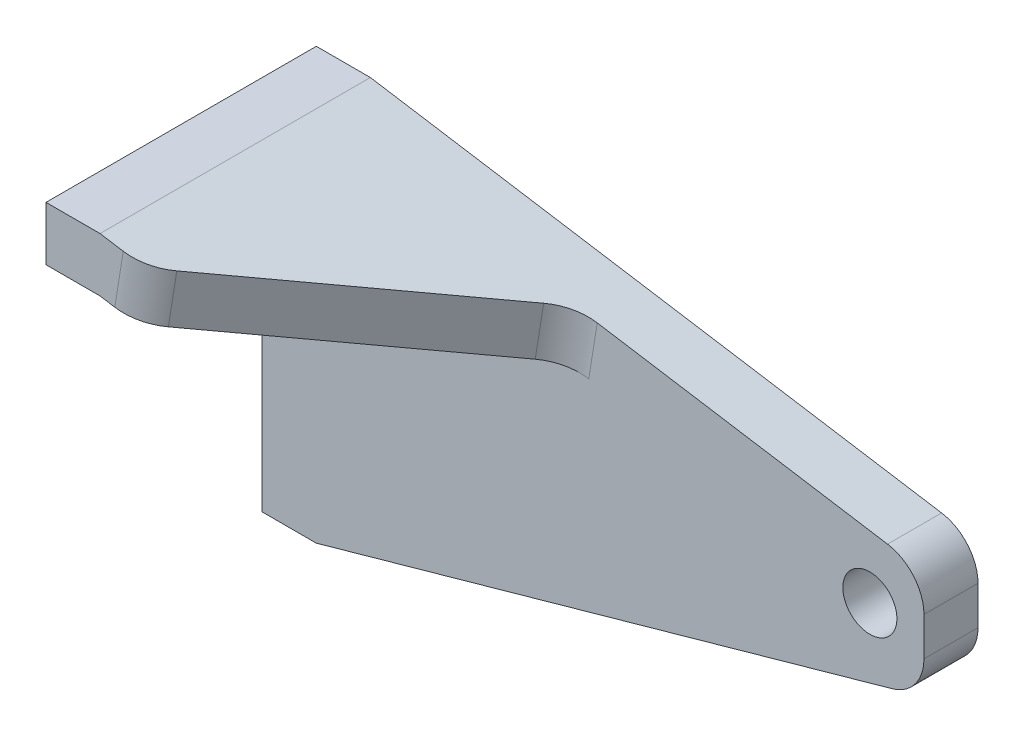
ISO-10303-21;
HEADER;
FILE_DESCRIPTION(('STEP AP214'),'2;1');
FILE_NAME('part.step','',(''),(''),'','','');
FILE_SCHEMA(('AUTOMOTIVE_DESIGN { 1 0 10303 214 1 1 1 1 }'));
ENDSEC;
DATA;
#1=APPLICATION_CONTEXT('core data for automotive mechanical design processes');
#2=APPLICATION_PROTOCOL_DEFINITION('international standard','automotive_design',2000,#1);
#3=PRODUCT_CONTEXT('',#1,'mechanical');
#4=PRODUCT('Part','Part','',(#3));
#5=PRODUCT_RELATED_PRODUCT_CATEGORY('part','',(#4));
#6=PRODUCT_DEFINITION_FORMATION('','',#4);
#7=PRODUCT_DEFINITION_CONTEXT('part definition',#1,'design');
#8=PRODUCT_DEFINITION('design','',#6,#7);
#9=PRODUCT_DEFINITION_SHAPE('','',#8);
#10=(LENGTH_UNIT() NAMED_UNIT(*) SI_UNIT(.MILLI.,.METRE.));
#11=(NAMED_UNIT(*) PLANE_ANGLE_UNIT() SI_UNIT($,.RADIAN.));
#12=(NAMED_UNIT(*) SI_UNIT($,.STERADIAN.) SOLID_ANGLE_UNIT());
#13=UNCERTAINTY_MEASURE_WITH_UNIT(LENGTH_MEASURE(1.E-05),#10,'distance_accuracy_value','');
#14=(GEOMETRIC_REPRESENTATION_CONTEXT(3) GLOBAL_UNCERTAINTY_ASSIGNED_CONTEXT((#13)) GLOBAL_UNIT_ASSIGNED_CONTEXT((#10,
#11,#12)) REPRESENTATION_CONTEXT('',''));
#15=CARTESIAN_POINT('',(0.,0.,0.));
#16=DIRECTION('',(0.,0.,1.));
#17=DIRECTION('',(1.,0.,0.));
#18=AXIS2_PLACEMENT_3D('',#15,#16,#17);
#19=CARTESIAN_POINT('',(0.,0.,-66.0761656667991));
#20=DIRECTION('',(0.,0.,1.));
#21=DIRECTION('',(1.,0.,0.));
#22=AXIS2_PLACEMENT_3D('',#19,#20,#21);
#23=PLANE('',#22);
#24=CARTESIAN_POINT('',(-87.0098258593013,74.4434540181082,-66.0761656667991));
#25=DIRECTION('',(0.,0.,1.));
#26=DIRECTION('',(1.,0.,0.));
#27=AXIS2_PLACEMENT_3D('',#24,#25,#26);
#28=CIRCLE('',#27,1.5875);
#29=CARTESIAN_POINT('',(-85.4223258593013,74.4434540181082,-66.0761656667991));
#30=VERTEX_POINT('',#29);
#31=EDGE_CURVE('E232',#30,#30,#28,.T.);
#32=ORIENTED_EDGE('',*,*,#31,.F.);
#33=EDGE_LOOP('',(#32));
#34=FACE_BOUND('',#33,.T.);
#35=DIRECTION('',(-0.987418694508758,0.158127548942683,0.));
#36=VECTOR('',#35,1.);
#37=CARTESIAN_POINT('',(10.0229648173004,62.5878469702539,-66.0761656667991));
#38=LINE('',#37,#36);
#39=CARTESIAN_POINT('',(-85.9731818849869,77.9608953745347,-66.0761656667991));
#40=VERTEX_POINT('',#39);
#41=CARTESIAN_POINT('',(-103.022541534426,80.6912198735552,-66.0761656667991));
#42=VERTEX_POINT('',#41);
#43=EDGE_CURVE('E183',#40,#42,#38,.T.);
#44=ORIENTED_EDGE('',*,*,#43,.T.);
#45=DIRECTION('',(0.158127548942685,0.987418694508758,0.));
#46=VECTOR('',#45,1.);
#47=CARTESIAN_POINT('',(-103.518279995394,77.5956085950626,-66.0761656667991));
#48=LINE('',#47,#46);
#49=CARTESIAN_POINT('',(-103.518279995394,77.5956085950626,-66.0761656667991));
#50=VERTEX_POINT('',#49);
#51=EDGE_CURVE('E210',#42,#50,#48,.F.);
#52=ORIENTED_EDGE('',*,*,#51,.T.);
#53=DIRECTION('',(-0.987418694508758,0.158127548942684,0.));
#54=VECTOR('',#53,1.);
#55=CARTESIAN_POINT('',(9.52722635633187,59.4922356917613,-66.0761656667991));
#56=LINE('',#55,#54);
#57=CARTESIAN_POINT('',(-119.521825859301,80.1584540181082,-66.0761656667991));
#58=VERTEX_POINT('',#57);
#59=EDGE_CURVE('E50',#50,#58,#56,.T.);
#60=ORIENTED_EDGE('',*,*,#59,.T.);
#61=DIRECTION('',(-1.,0.,0.));
#62=VECTOR('',#61,1.);
#63=CARTESIAN_POINT('',(0.,80.1584540181082,-66.0761656667991));
#64=LINE('',#63,#62);
#65=CARTESIAN_POINT('',(-122.696825859301,80.1584540181082,-66.0761656667991));
#66=VERTEX_POINT('',#65);
#67=EDGE_CURVE('E177',#58,#66,#64,.T.);
#68=ORIENTED_EDGE('',*,*,#67,.T.);
#69=DIRECTION('',(0.,-1.,0.));
#70=VECTOR('',#69,1.);
#71=CARTESIAN_POINT('',(-122.696825859301,0.,-66.0761656667991));
#72=LINE('',#71,#70);
#73=CARTESIAN_POINT('',(-122.696825859301,61.2354540181082,-66.0761656667991));
#74=VERTEX_POINT('',#73);
#75=EDGE_CURVE('E187',#66,#74,#72,.T.);
#76=ORIENTED_EDGE('',*,*,#75,.T.);
#77=DIRECTION('',(1.,0.,0.));
#78=VECTOR('',#77,1.);
#79=CARTESIAN_POINT('',(-2.67657523520784E-13,61.2354540181088,-66.0761656667991));
#80=LINE('',#79,#78);
#81=CARTESIAN_POINT('',(-119.521825859301,61.2354540181082,-66.0761656667991));
#82=VERTEX_POINT('',#81);
#83=EDGE_CURVE('E190',#74,#82,#80,.T.);
#84=ORIENTED_EDGE('',*,*,#83,.T.);
#85=DIRECTION('',(0.962678838326592,0.270646363800002,0.));
#86=VECTOR('',#85,1.);
#87=CARTESIAN_POINT('',(-24.7095321581169,87.8908675497579,-66.0761656667991));
#88=LINE('',#87,#86);
#89=CARTESIAN_POINT('',(-85.6873840952493,70.7476280371833,-66.0761656667991));
#90=VERTEX_POINT('',#89);
#91=EDGE_CURVE('E473',#82,#90,#88,.T.);
#92=ORIENTED_EDGE('',*,*,#91,.T.);
#93=CARTESIAN_POINT('',(-86.3748258593013,73.1928322865329,-66.0761656667991));
#94=DIRECTION('',(0.,0.,1.));
#95=DIRECTION('',(1.,0.,0.));
#96=AXIS2_PLACEMENT_3D('',#93,#94,#95);
#97=CIRCLE('',#96,2.54);
#98=CARTESIAN_POINT('',(-83.8348258593013,73.1928322865329,-66.0761656667991));
#99=VERTEX_POINT('',#98);
#100=EDGE_CURVE('E470',#90,#99,#97,.T.);
#101=ORIENTED_EDGE('',*,*,#100,.T.);
#102=DIRECTION('',(0.,1.,0.));
#103=VECTOR('',#102,1.);
#104=CARTESIAN_POINT('',(-83.8348258593013,0.,-66.0761656667991));
#105=LINE('',#104,#103);
#106=CARTESIAN_POINT('',(-83.8348258593013,75.4528518904825,-66.0761656667991));
#107=VERTEX_POINT('',#106);
#108=EDGE_CURVE('E228',#99,#107,#105,.T.);
#109=ORIENTED_EDGE('',*,*,#108,.T.);
#110=CARTESIAN_POINT('',(-86.3748258593013,75.4528518904825,-66.0761656667991));
#111=DIRECTION('',(0.,0.,1.));
#112=DIRECTION('',(1.,0.,0.));
#113=AXIS2_PLACEMENT_3D('',#110,#111,#112);
#114=CIRCLE('',#113,2.54);
#115=EDGE_CURVE('E225',#107,#40,#114,.T.);
#116=ORIENTED_EDGE('',*,*,#115,.T.);
#117=EDGE_LOOP('',(#44,#52,#60,#68,#76,#84,#92,#101,#109,#116));
#118=FACE_BOUND('',#117,.T.);
#119=ADVANCED_FACE('F35',(#34,#118),#23,.T.);
#120=CARTESIAN_POINT('',(10.0229648173004,62.5878469702539,-66.0761656667991));
#121=DIRECTION('',(-0.158127548942683,-0.987418694508758,0.));
#122=DIRECTION('',(0.987418694508758,-0.158127548942683,0.));
#123=AXIS2_PLACEMENT_3D('',#120,#121,#122);
#124=PLANE('',#123);
#125=DIRECTION('',(-0.987418694508758,0.158127548942683,0.));
#126=VECTOR('',#125,1.);
#127=CARTESIAN_POINT('',(10.0229648173004,62.5878469702539,-53.3761656667991));
#128=LINE('',#127,#126);
#129=CARTESIAN_POINT('',(-118.159923019976,83.1153556986434,-53.3761656667991));
#130=VERTEX_POINT('',#129);
#131=CARTESIAN_POINT('',(-119.521825859301,83.3334540181082,-53.3761656667991));
#132=VERTEX_POINT('',#131);
#133=EDGE_CURVE('E163',#130,#132,#128,.T.);
#134=ORIENTED_EDGE('',*,*,#133,.F.);
#135=CARTESIAN_POINT('',(-118.159923019976,83.1153556986434,-56.5511656667991));
#136=DIRECTION('',(-0.158127548942683,-0.987418694508758,0.));
#137=DIRECTION('',(0.987418694508758,-0.158127548942683,0.));
#138=AXIS2_PLACEMENT_3D('',#135,#136,#137);
#139=CIRCLE('',#138,3.175);
#140=CARTESIAN_POINT('',(-115.943104826121,82.7603492263178,-54.3061016365318));
#141=VERTEX_POINT('',#140);
#142=EDGE_CURVE('E203',#130,#141,#139,.F.);
#143=ORIENTED_EDGE('',*,*,#142,.T.);
#144=DIRECTION('',(-0.698210454757507,0.111813062149779,0.707106781186551));
#145=VECTOR('',#144,1.);
#146=CARTESIAN_POINT('',(-103.317906173449,80.7385202605874,-67.0921656667993));
#147=LINE('',#146,#145);
#148=CARTESIAN_POINT('',(-105.239359728281,81.0462263458807,-65.1462296970664));
#149=VERTEX_POINT('',#148);
#150=EDGE_CURVE('E198',#141,#149,#147,.F.);
#151=ORIENTED_EDGE('',*,*,#150,.T.);
#152=CARTESIAN_POINT('',(-103.022541534426,80.6912198735552,-62.9011656667991));
#153=DIRECTION('',(-0.158127548942683,-0.987418694508758,0.));
#154=DIRECTION('',(0.987418694508758,-0.158127548942683,0.));
#155=AXIS2_PLACEMENT_3D('',#152,#153,#154);
#156=CIRCLE('',#155,3.175);
#157=EDGE_CURVE('E11',#149,#42,#156,.T.);
#158=ORIENTED_EDGE('',*,*,#157,.T.);
#159=ORIENTED_EDGE('',*,*,#43,.F.);
#160=DIRECTION('',(0.,0.,-1.));
#161=VECTOR('',#160,1.);
#162=CARTESIAN_POINT('',(-85.9731818849869,77.9608953745347,-66.0761656667991));
#163=LINE('',#162,#161);
#164=CARTESIAN_POINT('',(-85.9731818849869,77.9608953745347,-69.2511656667991));
#165=VERTEX_POINT('',#164);
#166=EDGE_CURVE('E234',#40,#165,#163,.T.);
#167=ORIENTED_EDGE('',*,*,#166,.T.);
#168=DIRECTION('',(-0.987418694508758,0.158127548942683,0.));
#169=VECTOR('',#168,1.);
#170=CARTESIAN_POINT('',(10.0229648173004,62.5878469702539,-69.2511656667991));
#171=LINE('',#170,#169);
#172=CARTESIAN_POINT('',(-119.521825859301,83.3334540181082,-69.2511656667991));
#173=VERTEX_POINT('',#172);
#174=EDGE_CURVE('E157',#165,#173,#171,.T.);
#175=ORIENTED_EDGE('',*,*,#174,.T.);
#176=DIRECTION('',(0.,0.,-1.));
#177=VECTOR('',#176,1.);
#178=CARTESIAN_POINT('',(-119.521825859301,83.3334540181082,-66.0761656667991));
#179=LINE('',#178,#177);
#180=EDGE_CURVE('E146',#132,#173,#179,.T.);
#181=ORIENTED_EDGE('',*,*,#180,.F.);
#182=EDGE_LOOP('',(#134,#143,#151,#158,#159,#167,#175,#181));
#183=FACE_BOUND('',#182,.T.);
#184=ADVANCED_FACE('F221',(#183),#124,.F.);
#185=CARTESIAN_POINT('',(7.28493853326334E-13,83.3334540181072,-66.0761656667991));
#186=DIRECTION('',(0.,1.,0.));
#187=DIRECTION('',(-1.,0.,0.));
#188=AXIS2_PLACEMENT_3D('',#185,#186,#187);
#189=PLANE('',#188);
#190=DIRECTION('',(1.,0.,0.));
#191=VECTOR('',#190,1.);
#192=CARTESIAN_POINT('',(7.28493853326334E-13,83.3334540181072,-69.2511656667991));
#193=LINE('',#192,#191);
#194=CARTESIAN_POINT('',(-122.696825859301,83.3334540181082,-69.2511656667991));
#195=VERTEX_POINT('',#194);
#196=EDGE_CURVE('E143',#195,#173,#193,.T.);
#197=ORIENTED_EDGE('',*,*,#196,.F.);
#198=DIRECTION('',(0.,0.,-1.));
#199=VECTOR('',#198,1.);
#200=CARTESIAN_POINT('',(-122.696825859301,83.3334540181082,-66.0761656667991));
#201=LINE('',#200,#199);
#202=CARTESIAN_POINT('',(-122.696825859301,83.3334540181082,-53.3761656667991));
#203=VERTEX_POINT('',#202);
#204=EDGE_CURVE('E137',#203,#195,#201,.T.);
#205=ORIENTED_EDGE('',*,*,#204,.F.);
#206=DIRECTION('',(-1.,0.,0.));
#207=VECTOR('',#206,1.);
#208=CARTESIAN_POINT('',(7.28493853326334E-13,83.3334540181072,-53.3761656667991));
#209=LINE('',#208,#207);
#210=EDGE_CURVE('E141',#132,#203,#209,.T.);
#211=ORIENTED_EDGE('',*,*,#210,.F.);
#212=ORIENTED_EDGE('',*,*,#180,.T.);
#213=EDGE_LOOP('',(#197,#205,#211,#212));
#214=FACE_BOUND('',#213,.T.);
#215=ADVANCED_FACE('F139',(#214),#189,.T.);
#216=CARTESIAN_POINT('',(-122.696825859301,0.,-66.0761656667991));
#217=DIRECTION('',(1.,0.,0.));
#218=DIRECTION('',(0.,1.,0.));
#219=AXIS2_PLACEMENT_3D('',#216,#217,#218);
#220=PLANE('',#219);
#221=DIRECTION('',(0.,-1.,0.));
#222=VECTOR('',#221,1.);
#223=CARTESIAN_POINT('',(-122.696825859301,0.,-69.2511656667991));
#224=LINE('',#223,#222);
#225=CARTESIAN_POINT('',(-122.696825859301,61.2354540181082,-69.2511656667991));
#226=VERTEX_POINT('',#225);
#227=EDGE_CURVE('E269',#195,#226,#224,.T.);
#228=ORIENTED_EDGE('',*,*,#227,.T.);
#229=DIRECTION('',(0.,0.,-1.));
#230=VECTOR('',#229,1.);
#231=CARTESIAN_POINT('',(-122.696825859301,61.2354540181082,-66.0761656667991));
#232=LINE('',#231,#230);
#233=EDGE_CURVE('E147',#74,#226,#232,.T.);
#234=ORIENTED_EDGE('',*,*,#233,.F.);
#235=ORIENTED_EDGE('',*,*,#75,.F.);
#236=DIRECTION('',(0.,0.,-1.));
#237=VECTOR('',#236,1.);
#238=CARTESIAN_POINT('',(-122.696825859301,80.1584540181082,-33.179016585862));
#239=LINE('',#238,#237);
#240=CARTESIAN_POINT('',(-122.696825859301,80.1584540181082,-53.3761656667991));
#241=VERTEX_POINT('',#240);
#242=EDGE_CURVE('E153',#241,#66,#239,.T.);
#243=ORIENTED_EDGE('',*,*,#242,.F.);
#244=DIRECTION('',(0.,-1.,0.));
#245=VECTOR('',#244,1.);
#246=CARTESIAN_POINT('',(-122.696825859301,0.,-53.3761656667991));
#247=LINE('',#246,#245);
#248=EDGE_CURVE('E150',#203,#241,#247,.T.);
#249=ORIENTED_EDGE('',*,*,#248,.F.);
#250=ORIENTED_EDGE('',*,*,#204,.T.);
#251=EDGE_LOOP('',(#228,#234,#235,#243,#249,#250));
#252=FACE_BOUND('',#251,.T.);
#253=ADVANCED_FACE('F151',(#252),#220,.F.);
#254=CARTESIAN_POINT('',(-2.67657523520784E-13,61.2354540181088,-66.0761656667991));
#255=DIRECTION('',(0.,1.,0.));
#256=DIRECTION('',(-1.,0.,0.));
#257=AXIS2_PLACEMENT_3D('',#254,#255,#256);
#258=PLANE('',#257);
#259=DIRECTION('',(1.,0.,0.));
#260=VECTOR('',#259,1.);
#261=CARTESIAN_POINT('',(-2.67657523520784E-13,61.2354540181088,-69.2511656667991));
#262=LINE('',#261,#260);
#263=CARTESIAN_POINT('',(-119.521825859301,61.2354540181082,-69.2511656667991));
#264=VERTEX_POINT('',#263);
#265=EDGE_CURVE('E264',#226,#264,#262,.T.);
#266=ORIENTED_EDGE('',*,*,#265,.T.);
#267=DIRECTION('',(0.,0.,-1.));
#268=VECTOR('',#267,1.);
#269=CARTESIAN_POINT('',(-119.521825859301,61.2354540181082,-66.0761656667991));
#270=LINE('',#269,#268);
#271=EDGE_CURVE('E254',#82,#264,#270,.T.);
#272=ORIENTED_EDGE('',*,*,#271,.F.);
#273=ORIENTED_EDGE('',*,*,#83,.F.);
#274=ORIENTED_EDGE('',*,*,#233,.T.);
#275=EDGE_LOOP('',(#266,#272,#273,#274));
#276=FACE_BOUND('',#275,.T.);
#277=ADVANCED_FACE('F262',(#276),#258,.F.);
#278=CARTESIAN_POINT('',(-24.7095321581169,87.8908675497579,-66.0761656667991));
#279=DIRECTION('',(-0.270646363800002,0.962678838326592,0.));
#280=DIRECTION('',(-0.962678838326592,-0.270646363800002,0.));
#281=AXIS2_PLACEMENT_3D('',#278,#279,#280);
#282=PLANE('',#281);
#283=DIRECTION('',(0.962678838326592,0.270646363800002,0.));
#284=VECTOR('',#283,1.);
#285=CARTESIAN_POINT('',(-24.7095321581169,87.8908675497579,-69.2511656667991));
#286=LINE('',#285,#284);
#287=CARTESIAN_POINT('',(-85.6873840952493,70.7476280371833,-69.2511656667991));
#288=VERTEX_POINT('',#287);
#289=EDGE_CURVE('E271',#264,#288,#286,.T.);
#290=ORIENTED_EDGE('',*,*,#289,.T.);
#291=DIRECTION('',(0.,0.,-1.));
#292=VECTOR('',#291,1.);
#293=CARTESIAN_POINT('',(-85.6873840952493,70.7476280371833,-66.0761656667991));
#294=LINE('',#293,#292);
#295=EDGE_CURVE('E251',#90,#288,#294,.T.);
#296=ORIENTED_EDGE('',*,*,#295,.F.);
#297=ORIENTED_EDGE('',*,*,#91,.F.);
#298=ORIENTED_EDGE('',*,*,#271,.T.);
#299=EDGE_LOOP('',(#290,#296,#297,#298));
#300=FACE_BOUND('',#299,.T.);
#301=ADVANCED_FACE('F409',(#300),#282,.F.);
#302=CARTESIAN_POINT('',(-86.3748258593013,73.1928322865329,-66.0761656667991));
#303=DIRECTION('',(0.,0.,-1.));
#304=DIRECTION('',(-1.,0.,0.));
#305=AXIS2_PLACEMENT_3D('',#302,#303,#304);
#306=CYLINDRICAL_SURFACE('',#305,2.54);
#307=CARTESIAN_POINT('',(-86.3748258593013,73.1928322865329,-69.2511656667991));
#308=DIRECTION('',(0.,0.,1.));
#309=DIRECTION('',(1.,0.,0.));
#310=AXIS2_PLACEMENT_3D('',#307,#308,#309);
#311=CIRCLE('',#310,2.54);
#312=CARTESIAN_POINT('',(-83.8348258593013,73.1928322865329,-69.2511656667991));
#313=VERTEX_POINT('',#312);
#314=EDGE_CURVE('E273',#288,#313,#311,.T.);
#315=ORIENTED_EDGE('',*,*,#314,.T.);
#316=DIRECTION('',(0.,0.,-1.));
#317=VECTOR('',#316,1.);
#318=CARTESIAN_POINT('',(-83.8348258593013,73.1928322865329,-66.0761656667991));
#319=LINE('',#318,#317);
#320=EDGE_CURVE('E242',#99,#313,#319,.T.);
#321=ORIENTED_EDGE('',*,*,#320,.F.);
#322=ORIENTED_EDGE('',*,*,#100,.F.);
#323=ORIENTED_EDGE('',*,*,#295,.T.);
#324=EDGE_LOOP('',(#315,#321,#322,#323));
#325=FACE_BOUND('',#324,.T.);
#326=ADVANCED_FACE('F399',(#325),#306,.T.);
#327=CARTESIAN_POINT('',(-83.8348258593013,0.,-66.0761656667991));
#328=DIRECTION('',(-1.,0.,0.));
#329=DIRECTION('',(0.,0.,1.));
#330=AXIS2_PLACEMENT_3D('',#327,#328,#329);
#331=PLANE('',#330);
#332=DIRECTION('',(0.,1.,0.));
#333=VECTOR('',#332,1.);
#334=CARTESIAN_POINT('',(-83.8348258593013,0.,-69.2511656667991));
#335=LINE('',#334,#333);
#336=CARTESIAN_POINT('',(-83.8348258593013,75.4528518904825,-69.2511656667991));
#337=VERTEX_POINT('',#336);
#338=EDGE_CURVE('E279',#313,#337,#335,.T.);
#339=ORIENTED_EDGE('',*,*,#338,.T.);
#340=DIRECTION('',(0.,0.,-1.));
#341=VECTOR('',#340,1.);
#342=CARTESIAN_POINT('',(-83.8348258593013,75.4528518904825,-66.0761656667991));
#343=LINE('',#342,#341);
#344=EDGE_CURVE('E240',#107,#337,#343,.T.);
#345=ORIENTED_EDGE('',*,*,#344,.F.);
#346=ORIENTED_EDGE('',*,*,#108,.F.);
#347=ORIENTED_EDGE('',*,*,#320,.T.);
#348=EDGE_LOOP('',(#339,#345,#346,#347));
#349=FACE_BOUND('',#348,.T.);
#350=ADVANCED_FACE('F293',(#349),#331,.F.);
#351=CARTESIAN_POINT('',(-86.3748258593013,75.4528518904825,-66.0761656667991));
#352=DIRECTION('',(0.,0.,-1.));
#353=DIRECTION('',(-1.,0.,0.));
#354=AXIS2_PLACEMENT_3D('',#351,#352,#353);
#355=CYLINDRICAL_SURFACE('',#354,2.54);
#356=CARTESIAN_POINT('',(-86.3748258593013,75.4528518904825,-69.2511656667991));
#357=DIRECTION('',(0.,0.,1.));
#358=DIRECTION('',(1.,0.,0.));
#359=AXIS2_PLACEMENT_3D('',#356,#357,#358);
#360=CIRCLE('',#359,2.54);
#361=EDGE_CURVE('E237',#337,#165,#360,.T.);
#362=ORIENTED_EDGE('',*,*,#361,.T.);
#363=ORIENTED_EDGE('',*,*,#166,.F.);
#364=ORIENTED_EDGE('',*,*,#115,.F.);
#365=ORIENTED_EDGE('',*,*,#344,.T.);
#366=EDGE_LOOP('',(#362,#363,#364,#365));
#367=FACE_BOUND('',#366,.T.);
#368=ADVANCED_FACE('F235',(#367),#355,.T.);
#369=CARTESIAN_POINT('',(-87.0098258593013,74.4434540181082,-66.0761656667991));
#370=DIRECTION('',(0.,0.,-1.));
#371=DIRECTION('',(-1.,0.,0.));
#372=AXIS2_PLACEMENT_3D('',#369,#370,#371);
#373=CYLINDRICAL_SURFACE('',#372,1.5875);
#374=ORIENTED_EDGE('',*,*,#31,.T.);
#375=EDGE_LOOP('',(#374));
#376=FACE_BOUND('',#375,.T.);
#377=CARTESIAN_POINT('',(-87.0098258593013,74.4434540181082,-69.2511656667991));
#378=DIRECTION('',(0.,0.,1.));
#379=DIRECTION('',(1.,0.,0.));
#380=AXIS2_PLACEMENT_3D('',#377,#378,#379);
#381=CIRCLE('',#380,1.5875);
#382=CARTESIAN_POINT('',(-85.4223258593013,74.4434540181082,-69.2511656667991));
#383=VERTEX_POINT('',#382);
#384=EDGE_CURVE('E188',#383,#383,#381,.T.);
#385=ORIENTED_EDGE('',*,*,#384,.F.);
#386=EDGE_LOOP('',(#385));
#387=FACE_BOUND('',#386,.T.);
#388=ADVANCED_FACE('F283',(#376,#387),#373,.F.);
#389=CARTESIAN_POINT('',(0.,0.,-69.2511656667991));
#390=DIRECTION('',(0.,0.,1.));
#391=DIRECTION('',(1.,0.,0.));
#392=AXIS2_PLACEMENT_3D('',#389,#390,#391);
#393=PLANE('',#392);
#394=ORIENTED_EDGE('',*,*,#174,.F.);
#395=ORIENTED_EDGE('',*,*,#361,.F.);
#396=ORIENTED_EDGE('',*,*,#338,.F.);
#397=ORIENTED_EDGE('',*,*,#314,.F.);
#398=ORIENTED_EDGE('',*,*,#289,.F.);
#399=ORIENTED_EDGE('',*,*,#265,.F.);
#400=ORIENTED_EDGE('',*,*,#227,.F.);
#401=ORIENTED_EDGE('',*,*,#196,.T.);
#402=EDGE_LOOP('',(#394,#395,#396,#397,#398,#399,#400,#401));
#403=FACE_BOUND('',#402,.T.);
#404=ORIENTED_EDGE('',*,*,#384,.T.);
#405=EDGE_LOOP('',(#404));
#406=FACE_BOUND('',#405,.T.);
#407=ADVANCED_FACE('F267',(#403,#406),#393,.F.);
#408=CARTESIAN_POINT('',(0.,80.1584540181082,-33.179016585862));
#409=DIRECTION('',(0.,-1.,0.));
#410=DIRECTION('',(0.,0.,-1.));
#411=AXIS2_PLACEMENT_3D('',#408,#409,#410);
#412=PLANE('',#411);
#413=DIRECTION('',(0.,0.,-1.));
#414=VECTOR('',#413,1.);
#415=CARTESIAN_POINT('',(-119.521825859301,80.1584540181082,-33.179016585862));
#416=LINE('',#415,#414);
#417=CARTESIAN_POINT('',(-119.521825859301,80.1584540181082,-53.3761656667991));
#418=VERTEX_POINT('',#417);
#419=EDGE_CURVE('E173',#418,#58,#416,.T.);
#420=ORIENTED_EDGE('',*,*,#419,.F.);
#421=DIRECTION('',(-1.,0.,0.));
#422=VECTOR('',#421,1.);
#423=CARTESIAN_POINT('',(0.,80.1584540181082,-53.3761656667991));
#424=LINE('',#423,#422);
#425=EDGE_CURVE('E174',#418,#241,#424,.T.);
#426=ORIENTED_EDGE('',*,*,#425,.T.);
#427=ORIENTED_EDGE('',*,*,#242,.T.);
#428=ORIENTED_EDGE('',*,*,#67,.F.);
#429=EDGE_LOOP('',(#420,#426,#427,#428));
#430=FACE_BOUND('',#429,.T.);
#431=ADVANCED_FACE('F291',(#430),#412,.T.);
#432=CARTESIAN_POINT('',(9.52722635633187,59.4922356917613,-33.179016585862));
#433=DIRECTION('',(-0.158127548942683,-0.987418694508758,0.));
#434=DIRECTION('',(0.987418694508758,-0.158127548942684,0.));
#435=AXIS2_PLACEMENT_3D('',#432,#433,#434);
#436=PLANE('',#435);
#437=DIRECTION('',(0.698210454757507,-0.111813062149779,-0.707106781186551));
#438=VECTOR('',#437,1.);
#439=CARTESIAN_POINT('',(-63.8864478351335,71.2488739074764,-107.528099299946));
#440=LINE('',#439,#438);
#441=CARTESIAN_POINT('',(-105.735098189249,77.9506150673881,-65.1462296970663));
#442=VERTEX_POINT('',#441);
#443=CARTESIAN_POINT('',(-116.43884328709,79.6647379478253,-54.3061016365318));
#444=VERTEX_POINT('',#443);
#445=EDGE_CURVE('E196',#442,#444,#440,.F.);
#446=ORIENTED_EDGE('',*,*,#445,.T.);
#447=CARTESIAN_POINT('',(-118.655661480945,80.0197444201508,-56.5511656667991));
#448=DIRECTION('',(-0.158127548942683,-0.987418694508758,0.));
#449=DIRECTION('',(0.987418694508758,-0.158127548942684,0.));
#450=AXIS2_PLACEMENT_3D('',#447,#448,#449);
#451=CIRCLE('',#450,3.175);
#452=CARTESIAN_POINT('',(-118.655661480945,80.0197444201508,-53.3761656667991));
#453=VERTEX_POINT('',#452);
#454=EDGE_CURVE('E208',#444,#453,#451,.T.);
#455=ORIENTED_EDGE('',*,*,#454,.T.);
#456=DIRECTION('',(-0.987418694508758,0.158127548942684,0.));
#457=VECTOR('',#456,1.);
#458=CARTESIAN_POINT('',(9.52722635633187,59.4922356917613,-53.3761656667991));
#459=LINE('',#458,#457);
#460=EDGE_CURVE('E171',#453,#418,#459,.T.);
#461=ORIENTED_EDGE('',*,*,#460,.T.);
#462=ORIENTED_EDGE('',*,*,#419,.T.);
#463=ORIENTED_EDGE('',*,*,#59,.F.);
#464=CARTESIAN_POINT('',(-103.518279995394,77.5956085950626,-62.9011656667991));
#465=DIRECTION('',(-0.158127548942683,-0.987418694508758,0.));
#466=DIRECTION('',(0.987418694508758,-0.158127548942684,0.));
#467=AXIS2_PLACEMENT_3D('',#464,#465,#466);
#468=CIRCLE('',#467,3.175);
#469=EDGE_CURVE('E43',#50,#442,#468,.F.);
#470=ORIENTED_EDGE('',*,*,#469,.T.);
#471=EDGE_LOOP('',(#446,#455,#461,#462,#463,#470));
#472=FACE_BOUND('',#471,.T.);
#473=ADVANCED_FACE('F212',(#472),#436,.T.);
#474=CARTESIAN_POINT('',(-125.871825859301,80.1584540181082,-53.3761656667991));
#475=DIRECTION('',(0.,0.,1.));
#476=DIRECTION('',(1.,0.,0.));
#477=AXIS2_PLACEMENT_3D('',#474,#475,#476);
#478=PLANE('',#477);
#479=ORIENTED_EDGE('',*,*,#460,.F.);
#480=DIRECTION('',(-0.158127548942685,-0.987418694508758,0.));
#481=VECTOR('',#480,1.);
#482=CARTESIAN_POINT('',(-118.81443892396,79.0282674982137,-53.3761656667991));
#483=LINE('',#482,#481);
#484=EDGE_CURVE('E201',#453,#130,#483,.F.);
#485=ORIENTED_EDGE('',*,*,#484,.T.);
#486=ORIENTED_EDGE('',*,*,#133,.T.);
#487=ORIENTED_EDGE('',*,*,#210,.T.);
#488=ORIENTED_EDGE('',*,*,#248,.T.);
#489=ORIENTED_EDGE('',*,*,#425,.F.);
#490=EDGE_LOOP('',(#479,#485,#486,#487,#488,#489));
#491=FACE_BOUND('',#490,.T.);
#492=ADVANCED_FACE('F160',(#491),#478,.T.);
#493=CARTESIAN_POINT('',(-113.34087099075,18.1506732903338,-67.0921656667993));
#494=DIRECTION('',(-0.698210454757514,0.111813062149781,-0.707106781186544));
#495=DIRECTION('',(-0.158127548942685,-0.987418694508758,0.));
#496=AXIS2_PLACEMENT_3D('',#493,#494,#495);
#497=PLANE('',#496);
#498=ORIENTED_EDGE('',*,*,#150,.F.);
#499=DIRECTION('',(0.158127548942685,0.987418694508757,0.));
#500=VECTOR('',#499,1.);
#501=CARTESIAN_POINT('',(-125.966069643422,20.1725022560642,-54.3061016365318));
#502=LINE('',#501,#500);
#503=EDGE_CURVE('E58',#141,#444,#502,.F.);
#504=ORIENTED_EDGE('',*,*,#503,.T.);
#505=ORIENTED_EDGE('',*,*,#445,.F.);
#506=DIRECTION('',(-0.158127548942685,-0.987418694508757,0.));
#507=VECTOR('',#506,1.);
#508=CARTESIAN_POINT('',(-105.239359728281,81.0462263458807,-65.1462296970664));
#509=LINE('',#508,#507);
#510=EDGE_CURVE('E205',#442,#149,#509,.F.);
#511=ORIENTED_EDGE('',*,*,#510,.T.);
#512=EDGE_LOOP('',(#498,#504,#505,#511));
#513=FACE_BOUND('',#512,.T.);
#514=ADVANCED_FACE('F217',(#513),#497,.F.);
#515=CARTESIAN_POINT('',(-118.81443892396,79.0282674982137,-56.5511656667991));
#516=DIRECTION('',(-0.158127548942685,-0.987418694508757,0.));
#517=DIRECTION('',(0.987418694508758,-0.158127548942685,0.));
#518=AXIS2_PLACEMENT_3D('',#515,#516,#517);
#519=CYLINDRICAL_SURFACE('',#518,3.175);
#520=ORIENTED_EDGE('',*,*,#454,.F.);
#521=ORIENTED_EDGE('',*,*,#503,.F.);
#522=ORIENTED_EDGE('',*,*,#142,.F.);
#523=ORIENTED_EDGE('',*,*,#484,.F.);
#524=EDGE_LOOP('',(#520,#521,#522,#523));
#525=FACE_BOUND('',#524,.T.);
#526=ADVANCED_FACE('F325',(#525),#519,.T.);
#527=CARTESIAN_POINT('',(-113.045506351726,18.1033729033015,-62.9011656667991));
#528=DIRECTION('',(-0.158127548942685,-0.987418694508757,0.));
#529=DIRECTION('',(0.987418694508758,-0.158127548942685,0.));
#530=AXIS2_PLACEMENT_3D('',#527,#528,#529);
#531=CYLINDRICAL_SURFACE('',#530,3.175);
#532=ORIENTED_EDGE('',*,*,#157,.F.);
#533=ORIENTED_EDGE('',*,*,#510,.F.);
#534=ORIENTED_EDGE('',*,*,#469,.F.);
#535=ORIENTED_EDGE('',*,*,#51,.F.);
#536=EDGE_LOOP('',(#532,#533,#534,#535));
#537=FACE_BOUND('',#536,.T.);
#538=ADVANCED_FACE('F37',(#537),#531,.F.);
#539=CLOSED_SHELL('',(#119,#184,#215,#253,#277,#301,#326,#350,#368,#388,#407,#431,#473,#492,
#514,#526,#538));
#540=MANIFOLD_SOLID_BREP('B2',#539);
#541=ADVANCED_BREP_SHAPE_REPRESENTATION('',(#18,#540),#14);
#542=SHAPE_DEFINITION_REPRESENTATION(#9,#541);
ENDSEC;
END-ISO-10303-21;
